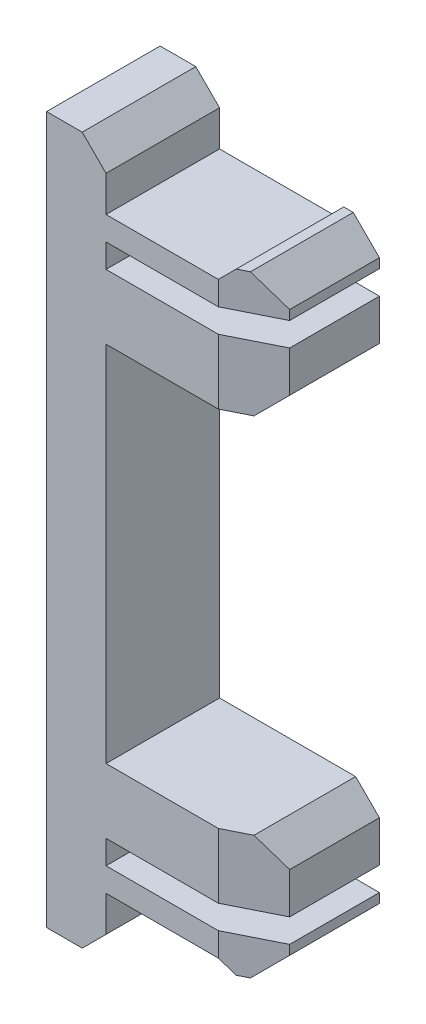
ISO-10303-21;
HEADER;
FILE_DESCRIPTION(('STEP AP214'),'2;1');
FILE_NAME('part.step','',(''),(''),'','','');
FILE_SCHEMA(('AUTOMOTIVE_DESIGN { 1 0 10303 214 1 1 1 1 }'));
ENDSEC;
DATA;
#1=APPLICATION_CONTEXT('core data for automotive mechanical design processes');
#2=APPLICATION_PROTOCOL_DEFINITION('international standard','automotive_design',2000,#1);
#3=PRODUCT_CONTEXT('',#1,'mechanical');
#4=PRODUCT('Part','Part','',(#3));
#5=PRODUCT_RELATED_PRODUCT_CATEGORY('part','',(#4));
#6=PRODUCT_DEFINITION_FORMATION('','',#4);
#7=PRODUCT_DEFINITION_CONTEXT('part definition',#1,'design');
#8=PRODUCT_DEFINITION('design','',#6,#7);
#9=PRODUCT_DEFINITION_SHAPE('','',#8);
#10=(LENGTH_UNIT() NAMED_UNIT(*) SI_UNIT(.MILLI.,.METRE.));
#11=(NAMED_UNIT(*) PLANE_ANGLE_UNIT() SI_UNIT($,.RADIAN.));
#12=(NAMED_UNIT(*) SI_UNIT($,.STERADIAN.) SOLID_ANGLE_UNIT());
#13=UNCERTAINTY_MEASURE_WITH_UNIT(LENGTH_MEASURE(1.E-05),#10,'distance_accuracy_value','');
#14=(GEOMETRIC_REPRESENTATION_CONTEXT(3) GLOBAL_UNCERTAINTY_ASSIGNED_CONTEXT((#13)) GLOBAL_UNIT_ASSIGNED_CONTEXT((#10,
#11,#12)) REPRESENTATION_CONTEXT('',''));
#15=CARTESIAN_POINT('',(0.,0.,0.));
#16=DIRECTION('',(0.,0.,1.));
#17=DIRECTION('',(1.,0.,0.));
#18=AXIS2_PLACEMENT_3D('',#15,#16,#17);
#19=CARTESIAN_POINT('',(-2.6825,-17.605,3.032500031));
#20=DIRECTION('',(-1.,0.,0.));
#21=DIRECTION('',(0.,0.,1.));
#22=AXIS2_PLACEMENT_3D('',#19,#20,#21);
#23=PLANE('',#22);
#24=DIRECTION('',(0.,0.,-1.));
#25=VECTOR('',#24,1.);
#26=CARTESIAN_POINT('',(-2.6825,-9.7,12.2467932757367));
#27=LINE('',#26,#25);
#28=CARTESIAN_POINT('',(-2.6825,-9.7,3.032500031));
#29=VERTEX_POINT('',#28);
#30=CARTESIAN_POINT('',(-2.6825,-9.7,-3.032500031));
#31=VERTEX_POINT('',#30);
#32=EDGE_CURVE('E290',#29,#31,#27,.T.);
#33=ORIENTED_EDGE('',*,*,#32,.T.);
#34=DIRECTION('',(0.,1.,0.));
#35=VECTOR('',#34,1.);
#36=CARTESIAN_POINT('',(-2.6825,-17.605,-3.032500031));
#37=LINE('',#36,#35);
#38=CARTESIAN_POINT('',(-2.6825,9.7,-3.032500031));
#39=VERTEX_POINT('',#38);
#40=EDGE_CURVE('E484',#31,#39,#37,.T.);
#41=ORIENTED_EDGE('',*,*,#40,.T.);
#42=DIRECTION('',(0.,0.,-1.));
#43=VECTOR('',#42,1.);
#44=CARTESIAN_POINT('',(-2.6825,9.7,12.2467932757367));
#45=LINE('',#44,#43);
#46=CARTESIAN_POINT('',(-2.6825,9.7,3.032500031));
#47=VERTEX_POINT('',#46);
#48=EDGE_CURVE('E416',#47,#39,#45,.T.);
#49=ORIENTED_EDGE('',*,*,#48,.F.);
#50=DIRECTION('',(0.,1.,0.));
#51=VECTOR('',#50,1.);
#52=CARTESIAN_POINT('',(-2.6825,-17.605,3.032500031));
#53=LINE('',#52,#51);
#54=EDGE_CURVE('E67',#29,#47,#53,.T.);
#55=ORIENTED_EDGE('',*,*,#54,.F.);
#56=EDGE_LOOP('',(#33,#41,#49,#55));
#57=FACE_BOUND('',#56,.T.);
#58=ADVANCED_FACE('F51',(#57),#23,.F.);
#59=DIRECTION('',(0.,0.,-1.));
#60=VECTOR('',#59,1.);
#61=CARTESIAN_POINT('',(-2.6825,-13.16,12.2467932757367));
#62=LINE('',#61,#60);
#63=CARTESIAN_POINT('',(-2.6825,-13.16,3.032500031));
#64=VERTEX_POINT('',#63);
#65=CARTESIAN_POINT('',(-2.6825,-13.16,-3.032500031));
#66=VERTEX_POINT('',#65);
#67=EDGE_CURVE('E75',#64,#66,#62,.T.);
#68=ORIENTED_EDGE('',*,*,#67,.F.);
#69=CARTESIAN_POINT('',(-2.6825,-14.43,3.032500031));
#70=VERTEX_POINT('',#69);
#71=EDGE_CURVE('E457',#70,#64,#53,.T.);
#72=ORIENTED_EDGE('',*,*,#71,.F.);
#73=DIRECTION('',(0.,0.,-1.));
#74=VECTOR('',#73,1.);
#75=CARTESIAN_POINT('',(-2.6825,-14.43,12.2467932757367));
#76=LINE('',#75,#74);
#77=CARTESIAN_POINT('',(-2.6825,-14.43,-3.032500031));
#78=VERTEX_POINT('',#77);
#79=EDGE_CURVE('E1014',#70,#78,#76,.T.);
#80=ORIENTED_EDGE('',*,*,#79,.T.);
#81=EDGE_CURVE('E483',#78,#66,#37,.T.);
#82=ORIENTED_EDGE('',*,*,#81,.T.);
#83=EDGE_LOOP('',(#68,#72,#80,#82));
#84=FACE_BOUND('',#83,.T.);
#85=ADVANCED_FACE('F637',(#84),#23,.F.);
#86=DIRECTION('',(0.,0.,-1.));
#87=VECTOR('',#86,1.);
#88=CARTESIAN_POINT('',(-2.6825,14.43,12.2467932757367));
#89=LINE('',#88,#87);
#90=CARTESIAN_POINT('',(-2.6825,14.43,3.032500031));
#91=VERTEX_POINT('',#90);
#92=CARTESIAN_POINT('',(-2.6825,14.43,-3.032500031));
#93=VERTEX_POINT('',#92);
#94=EDGE_CURVE('E356',#91,#93,#89,.T.);
#95=ORIENTED_EDGE('',*,*,#94,.F.);
#96=CARTESIAN_POINT('',(-2.6825,13.16,3.032500031));
#97=VERTEX_POINT('',#96);
#98=EDGE_CURVE('E458',#97,#91,#53,.T.);
#99=ORIENTED_EDGE('',*,*,#98,.F.);
#100=DIRECTION('',(0.,0.,-1.));
#101=VECTOR('',#100,1.);
#102=CARTESIAN_POINT('',(-2.6825,13.16,12.2467932757367));
#103=LINE('',#102,#101);
#104=CARTESIAN_POINT('',(-2.6825,13.16,-3.032500031));
#105=VERTEX_POINT('',#104);
#106=EDGE_CURVE('E435',#97,#105,#103,.T.);
#107=ORIENTED_EDGE('',*,*,#106,.T.);
#108=EDGE_CURVE('E485',#105,#93,#37,.T.);
#109=ORIENTED_EDGE('',*,*,#108,.T.);
#110=EDGE_LOOP('',(#95,#99,#107,#109));
#111=FACE_BOUND('',#110,.T.);
#112=ADVANCED_FACE('F615',(#111),#23,.F.);
#113=CARTESIAN_POINT('',(-2.6825,-17.605,-3.032500031));
#114=VERTEX_POINT('',#113);
#115=CARTESIAN_POINT('',(-2.6825,-15.7,-3.032500031));
#116=VERTEX_POINT('',#115);
#117=EDGE_CURVE('E478',#114,#116,#37,.T.);
#118=ORIENTED_EDGE('',*,*,#117,.T.);
#119=DIRECTION('',(0.,0.,-1.));
#120=VECTOR('',#119,1.);
#121=CARTESIAN_POINT('',(-2.6825,-15.7,12.2467932757367));
#122=LINE('',#121,#120);
#123=CARTESIAN_POINT('',(-2.6825,-15.7,3.032500031));
#124=VERTEX_POINT('',#123);
#125=EDGE_CURVE('E1038',#124,#116,#122,.T.);
#126=ORIENTED_EDGE('',*,*,#125,.F.);
#127=CARTESIAN_POINT('',(-2.6825,-17.605,3.032500031));
#128=VERTEX_POINT('',#127);
#129=EDGE_CURVE('E452',#128,#124,#53,.T.);
#130=ORIENTED_EDGE('',*,*,#129,.F.);
#131=DIRECTION('',(0.,0.,-1.));
#132=VECTOR('',#131,1.);
#133=CARTESIAN_POINT('',(-2.6825,-17.605,3.032500031));
#134=LINE('',#133,#132);
#135=EDGE_CURVE('E60',#128,#114,#134,.T.);
#136=ORIENTED_EDGE('',*,*,#135,.T.);
#137=EDGE_LOOP('',(#118,#126,#130,#136));
#138=FACE_BOUND('',#137,.T.);
#139=ADVANCED_FACE('F519',(#138),#23,.F.);
#140=CARTESIAN_POINT('',(-3.9525,-18.875,3.032500031));
#141=DIRECTION('',(-0.707106781186544,0.707106781186551,0.));
#142=DIRECTION('',(-0.707106781186551,-0.707106781186544,0.));
#143=AXIS2_PLACEMENT_3D('',#140,#141,#142);
#144=PLANE('',#143);
#145=DIRECTION('',(0.707106781186551,0.707106781186544,0.));
#146=VECTOR('',#145,1.);
#147=CARTESIAN_POINT('',(-3.9525,-18.875,-3.032500031));
#148=LINE('',#147,#146);
#149=CARTESIAN_POINT('',(-3.9525,-18.875,-3.032500031));
#150=VERTEX_POINT('',#149);
#151=EDGE_CURVE('E387',#150,#114,#148,.T.);
#152=ORIENTED_EDGE('',*,*,#151,.T.);
#153=ORIENTED_EDGE('',*,*,#135,.F.);
#154=DIRECTION('',(0.707106781186551,0.707106781186544,0.));
#155=VECTOR('',#154,1.);
#156=CARTESIAN_POINT('',(-3.9525,-18.875,3.032500031));
#157=LINE('',#156,#155);
#158=CARTESIAN_POINT('',(-3.9525,-18.875,3.032500031));
#159=VERTEX_POINT('',#158);
#160=EDGE_CURVE('E446',#159,#128,#157,.T.);
#161=ORIENTED_EDGE('',*,*,#160,.F.);
#162=DIRECTION('',(0.,0.,-1.));
#163=VECTOR('',#162,1.);
#164=CARTESIAN_POINT('',(-3.9525,-18.875,3.032500031));
#165=LINE('',#164,#163);
#166=EDGE_CURVE('E473',#159,#150,#165,.T.);
#167=ORIENTED_EDGE('',*,*,#166,.T.);
#168=EDGE_LOOP('',(#152,#153,#161,#167));
#169=FACE_BOUND('',#168,.T.);
#170=ADVANCED_FACE('F53',(#169),#144,.F.);
#171=CARTESIAN_POINT('',(-2.6825,15.7,3.032500031));
#172=VERTEX_POINT('',#171);
#173=CARTESIAN_POINT('',(-2.6825,17.605,3.032500031));
#174=VERTEX_POINT('',#173);
#175=EDGE_CURVE('E450',#172,#174,#53,.T.);
#176=ORIENTED_EDGE('',*,*,#175,.F.);
#177=DIRECTION('',(0.,0.,-1.));
#178=VECTOR('',#177,1.);
#179=CARTESIAN_POINT('',(-2.6825,15.7,12.2467932757367));
#180=LINE('',#179,#178);
#181=CARTESIAN_POINT('',(-2.6825,15.7,-3.032500031));
#182=VERTEX_POINT('',#181);
#183=EDGE_CURVE('E391',#172,#182,#180,.T.);
#184=ORIENTED_EDGE('',*,*,#183,.T.);
#185=CARTESIAN_POINT('',(-2.6825,17.605,-3.032500031));
#186=VERTEX_POINT('',#185);
#187=EDGE_CURVE('E477',#182,#186,#37,.T.);
#188=ORIENTED_EDGE('',*,*,#187,.T.);
#189=DIRECTION('',(0.,0.,-1.));
#190=VECTOR('',#189,1.);
#191=CARTESIAN_POINT('',(-2.6825,17.605,3.032500031));
#192=LINE('',#191,#190);
#193=EDGE_CURVE('E511',#174,#186,#192,.T.);
#194=ORIENTED_EDGE('',*,*,#193,.F.);
#195=EDGE_LOOP('',(#176,#184,#188,#194));
#196=FACE_BOUND('',#195,.T.);
#197=ADVANCED_FACE('F546',(#196),#23,.F.);
#198=CARTESIAN_POINT('',(-3.9525,18.875,3.032500031));
#199=DIRECTION('',(0.707106781186544,0.707106781186551,0.));
#200=DIRECTION('',(-0.707106781186551,0.707106781186544,0.));
#201=AXIS2_PLACEMENT_3D('',#198,#199,#200);
#202=PLANE('',#201);
#203=DIRECTION('',(0.707106781186551,-0.707106781186544,0.));
#204=VECTOR('',#203,1.);
#205=CARTESIAN_POINT('',(-3.9525,18.875,-3.032500031));
#206=LINE('',#205,#204);
#207=CARTESIAN_POINT('',(-3.9525,18.875,-3.032500031));
#208=VERTEX_POINT('',#207);
#209=EDGE_CURVE('E482',#208,#186,#206,.T.);
#210=ORIENTED_EDGE('',*,*,#209,.F.);
#211=DIRECTION('',(0.,0.,-1.));
#212=VECTOR('',#211,1.);
#213=CARTESIAN_POINT('',(-3.9525,18.875,3.032500031));
#214=LINE('',#213,#212);
#215=CARTESIAN_POINT('',(-3.9525,18.875,3.032500031));
#216=VERTEX_POINT('',#215);
#217=EDGE_CURVE('E508',#216,#208,#214,.T.);
#218=ORIENTED_EDGE('',*,*,#217,.F.);
#219=DIRECTION('',(0.707106781186551,-0.707106781186544,0.));
#220=VECTOR('',#219,1.);
#221=CARTESIAN_POINT('',(-3.9525,18.875,3.032500031));
#222=LINE('',#221,#220);
#223=EDGE_CURVE('E456',#216,#174,#222,.T.);
#224=ORIENTED_EDGE('',*,*,#223,.T.);
#225=ORIENTED_EDGE('',*,*,#193,.T.);
#226=EDGE_LOOP('',(#210,#218,#224,#225));
#227=FACE_BOUND('',#226,.T.);
#228=ADVANCED_FACE('F541',(#227),#202,.T.);
#229=CARTESIAN_POINT('',(-3.9525,18.875,3.032500031));
#230=DIRECTION('',(0.,-1.,0.));
#231=DIRECTION('',(0.,0.,-1.));
#232=AXIS2_PLACEMENT_3D('',#229,#230,#231);
#233=PLANE('',#232);
#234=DIRECTION('',(-1.,0.,0.));
#235=VECTOR('',#234,1.);
#236=CARTESIAN_POINT('',(-3.9525,18.875,-3.032500031));
#237=LINE('',#236,#235);
#238=CARTESIAN_POINT('',(-5.8575,18.875,-3.032500031));
#239=VERTEX_POINT('',#238);
#240=EDGE_CURVE('E489',#208,#239,#237,.T.);
#241=ORIENTED_EDGE('',*,*,#240,.T.);
#242=DIRECTION('',(0.,0.,-1.));
#243=VECTOR('',#242,1.);
#244=CARTESIAN_POINT('',(-5.8575,18.875,3.032500031));
#245=LINE('',#244,#243);
#246=CARTESIAN_POINT('',(-5.8575,18.875,3.032500031));
#247=VERTEX_POINT('',#246);
#248=EDGE_CURVE('E505',#247,#239,#245,.T.);
#249=ORIENTED_EDGE('',*,*,#248,.F.);
#250=DIRECTION('',(-1.,0.,0.));
#251=VECTOR('',#250,1.);
#252=CARTESIAN_POINT('',(-3.9525,18.875,3.032500031));
#253=LINE('',#252,#251);
#254=EDGE_CURVE('E462',#216,#247,#253,.T.);
#255=ORIENTED_EDGE('',*,*,#254,.F.);
#256=ORIENTED_EDGE('',*,*,#217,.T.);
#257=EDGE_LOOP('',(#241,#249,#255,#256));
#258=FACE_BOUND('',#257,.T.);
#259=ADVANCED_FACE('F645',(#258),#233,.F.);
#260=CARTESIAN_POINT('',(-5.8575,-18.875,3.032500031));
#261=DIRECTION('',(-1.,0.,0.));
#262=DIRECTION('',(0.,0.,1.));
#263=AXIS2_PLACEMENT_3D('',#260,#261,#262);
#264=PLANE('',#263);
#265=DIRECTION('',(0.,1.,0.));
#266=VECTOR('',#265,1.);
#267=CARTESIAN_POINT('',(-5.8575,-18.875,-3.032500031));
#268=LINE('',#267,#266);
#269=CARTESIAN_POINT('',(-5.8575,-18.875,-3.032500031));
#270=VERTEX_POINT('',#269);
#271=EDGE_CURVE('E493',#270,#239,#268,.T.);
#272=ORIENTED_EDGE('',*,*,#271,.F.);
#273=DIRECTION('',(0.,0.,-1.));
#274=VECTOR('',#273,1.);
#275=CARTESIAN_POINT('',(-5.8575,-18.875,3.032500031));
#276=LINE('',#275,#274);
#277=CARTESIAN_POINT('',(-5.8575,-18.875,3.032500031));
#278=VERTEX_POINT('',#277);
#279=EDGE_CURVE('E502',#278,#270,#276,.T.);
#280=ORIENTED_EDGE('',*,*,#279,.F.);
#281=DIRECTION('',(0.,1.,0.));
#282=VECTOR('',#281,1.);
#283=CARTESIAN_POINT('',(-5.8575,-18.875,3.032500031));
#284=LINE('',#283,#282);
#285=EDGE_CURVE('E465',#278,#247,#284,.T.);
#286=ORIENTED_EDGE('',*,*,#285,.T.);
#287=ORIENTED_EDGE('',*,*,#248,.T.);
#288=EDGE_LOOP('',(#272,#280,#286,#287));
#289=FACE_BOUND('',#288,.T.);
#290=ADVANCED_FACE('F534',(#289),#264,.T.);
#291=CARTESIAN_POINT('',(-3.9525,-18.875,3.032500031));
#292=DIRECTION('',(0.,-1.,0.));
#293=DIRECTION('',(0.,0.,-1.));
#294=AXIS2_PLACEMENT_3D('',#291,#292,#293);
#295=PLANE('',#294);
#296=DIRECTION('',(-1.,0.,0.));
#297=VECTOR('',#296,1.);
#298=CARTESIAN_POINT('',(-3.9525,-18.875,-3.032500031));
#299=LINE('',#298,#297);
#300=EDGE_CURVE('E451',#150,#270,#299,.T.);
#301=ORIENTED_EDGE('',*,*,#300,.F.);
#302=ORIENTED_EDGE('',*,*,#166,.F.);
#303=DIRECTION('',(-1.,0.,0.));
#304=VECTOR('',#303,1.);
#305=CARTESIAN_POINT('',(-3.9525,-18.875,3.032500031));
#306=LINE('',#305,#304);
#307=EDGE_CURVE('E469',#159,#278,#306,.T.);
#308=ORIENTED_EDGE('',*,*,#307,.T.);
#309=ORIENTED_EDGE('',*,*,#279,.T.);
#310=EDGE_LOOP('',(#301,#302,#308,#309));
#311=FACE_BOUND('',#310,.T.);
#312=ADVANCED_FACE('F529',(#311),#295,.T.);
#313=CARTESIAN_POINT('',(0.,0.,3.032500031));
#314=DIRECTION('',(0.,0.,-1.));
#315=DIRECTION('',(-1.,0.,0.));
#316=AXIS2_PLACEMENT_3D('',#313,#314,#315);
#317=PLANE('',#316);
#318=ORIENTED_EDGE('',*,*,#54,.T.);
#319=DIRECTION('',(-1.,0.,0.));
#320=VECTOR('',#319,1.);
#321=CARTESIAN_POINT('',(0.,9.7,3.032500031));
#322=LINE('',#321,#320);
#323=CARTESIAN_POINT('',(3.3175,9.7,3.032500031));
#324=VERTEX_POINT('',#323);
#325=EDGE_CURVE('E377',#324,#47,#322,.T.);
#326=ORIENTED_EDGE('',*,*,#325,.F.);
#327=DIRECTION('',(0.,-1.,0.));
#328=VECTOR('',#327,1.);
#329=CARTESIAN_POINT('',(3.3175,18.875,3.032500031));
#330=LINE('',#329,#328);
#331=CARTESIAN_POINT('',(3.3175,13.16,3.032500031));
#332=VERTEX_POINT('',#331);
#333=EDGE_CURVE('E325',#332,#324,#330,.T.);
#334=ORIENTED_EDGE('',*,*,#333,.F.);
#335=DIRECTION('',(1.,0.,0.));
#336=VECTOR('',#335,1.);
#337=CARTESIAN_POINT('',(0.,13.16,3.032500031));
#338=LINE('',#337,#336);
#339=EDGE_CURVE('E424',#97,#332,#338,.T.);
#340=ORIENTED_EDGE('',*,*,#339,.F.);
#341=ORIENTED_EDGE('',*,*,#98,.T.);
#342=DIRECTION('',(1.,0.,0.));
#343=VECTOR('',#342,1.);
#344=CARTESIAN_POINT('',(0.,14.43,3.032500031));
#345=LINE('',#344,#343);
#346=CARTESIAN_POINT('',(3.3175,14.43,3.032500031));
#347=VERTEX_POINT('',#346);
#348=EDGE_CURVE('E382',#91,#347,#345,.T.);
#349=ORIENTED_EDGE('',*,*,#348,.T.);
#350=CARTESIAN_POINT('',(3.3175,15.7,3.032500031));
#351=VERTEX_POINT('',#350);
#352=EDGE_CURVE('E331',#351,#347,#330,.T.);
#353=ORIENTED_EDGE('',*,*,#352,.F.);
#354=DIRECTION('',(-1.,0.,0.));
#355=VECTOR('',#354,1.);
#356=CARTESIAN_POINT('',(0.,15.7,3.032500031));
#357=LINE('',#356,#355);
#358=EDGE_CURVE('E378',#351,#172,#357,.T.);
#359=ORIENTED_EDGE('',*,*,#358,.T.);
#360=ORIENTED_EDGE('',*,*,#175,.T.);
#361=ORIENTED_EDGE('',*,*,#223,.F.);
#362=ORIENTED_EDGE('',*,*,#254,.T.);
#363=ORIENTED_EDGE('',*,*,#285,.F.);
#364=ORIENTED_EDGE('',*,*,#307,.F.);
#365=ORIENTED_EDGE('',*,*,#160,.T.);
#366=ORIENTED_EDGE('',*,*,#129,.T.);
#367=DIRECTION('',(-1.,0.,0.));
#368=VECTOR('',#367,1.);
#369=CARTESIAN_POINT('',(0.,-15.7,3.032500031));
#370=LINE('',#369,#368);
#371=CARTESIAN_POINT('',(3.3175,-15.7,3.032500031));
#372=VERTEX_POINT('',#371);
#373=EDGE_CURVE('E1029',#372,#124,#370,.T.);
#374=ORIENTED_EDGE('',*,*,#373,.F.);
#375=DIRECTION('',(0.,1.,0.));
#376=VECTOR('',#375,1.);
#377=CARTESIAN_POINT('',(3.3175,-18.875,3.032500031));
#378=LINE('',#377,#376);
#379=CARTESIAN_POINT('',(3.3175,-14.43,3.032500031));
#380=VERTEX_POINT('',#379);
#381=EDGE_CURVE('E286',#372,#380,#378,.T.);
#382=ORIENTED_EDGE('',*,*,#381,.T.);
#383=DIRECTION('',(1.,0.,0.));
#384=VECTOR('',#383,1.);
#385=CARTESIAN_POINT('',(0.,-14.43,3.032500031));
#386=LINE('',#385,#384);
#387=EDGE_CURVE('E322',#70,#380,#386,.T.);
#388=ORIENTED_EDGE('',*,*,#387,.F.);
#389=ORIENTED_EDGE('',*,*,#71,.T.);
#390=DIRECTION('',(1.,0.,0.));
#391=VECTOR('',#390,1.);
#392=CARTESIAN_POINT('',(0.,-13.16,3.032500031));
#393=LINE('',#392,#391);
#394=CARTESIAN_POINT('',(3.3175,-13.16,3.032500031));
#395=VERTEX_POINT('',#394);
#396=EDGE_CURVE('E284',#64,#395,#393,.T.);
#397=ORIENTED_EDGE('',*,*,#396,.T.);
#398=CARTESIAN_POINT('',(3.3175,-9.7,3.032500031));
#399=VERTEX_POINT('',#398);
#400=EDGE_CURVE('E270',#395,#399,#378,.T.);
#401=ORIENTED_EDGE('',*,*,#400,.T.);
#402=DIRECTION('',(-1.,0.,0.));
#403=VECTOR('',#402,1.);
#404=CARTESIAN_POINT('',(0.,-9.7,3.032500031));
#405=LINE('',#404,#403);
#406=EDGE_CURVE('E281',#399,#29,#405,.T.);
#407=ORIENTED_EDGE('',*,*,#406,.T.);
#408=EDGE_LOOP('',(#318,#326,#334,#340,#341,#349,#353,#359,#360,#361,#362,#363,#364,#365,#366,
#374,#382,#388,#389,#397,#401,#407));
#409=FACE_BOUND('',#408,.T.);
#410=ADVANCED_FACE('F280',(#409),#317,.F.);
#411=CARTESIAN_POINT('',(0.,0.,-3.032500031));
#412=DIRECTION('',(0.,0.,-1.));
#413=DIRECTION('',(-1.,0.,0.));
#414=AXIS2_PLACEMENT_3D('',#411,#412,#413);
#415=PLANE('',#414);
#416=ORIENTED_EDGE('',*,*,#108,.F.);
#417=DIRECTION('',(-1.,0.,0.));
#418=VECTOR('',#417,1.);
#419=CARTESIAN_POINT('',(0.,13.16,-3.032500031));
#420=LINE('',#419,#418);
#421=CARTESIAN_POINT('',(5.8575,13.16,-3.032500031));
#422=VERTEX_POINT('',#421);
#423=EDGE_CURVE('E417',#422,#105,#420,.T.);
#424=ORIENTED_EDGE('',*,*,#423,.F.);
#425=DIRECTION('',(0.,1.,0.));
#426=VECTOR('',#425,1.);
#427=CARTESIAN_POINT('',(5.8575,0.,-3.032500031));
#428=LINE('',#427,#426);
#429=CARTESIAN_POINT('',(5.8575,10.97,-3.032500031));
#430=VERTEX_POINT('',#429);
#431=EDGE_CURVE('E411',#430,#422,#428,.T.);
#432=ORIENTED_EDGE('',*,*,#431,.F.);
#433=DIRECTION('',(0.707106781186548,0.707106781186548,0.));
#434=VECTOR('',#433,1.);
#435=CARTESIAN_POINT('',(-2.55625,2.55625,-3.032500031));
#436=LINE('',#435,#434);
#437=CARTESIAN_POINT('',(4.5875,9.7,-3.032500031));
#438=VERTEX_POINT('',#437);
#439=EDGE_CURVE('E351',#438,#430,#436,.T.);
#440=ORIENTED_EDGE('',*,*,#439,.F.);
#441=DIRECTION('',(1.,0.,0.));
#442=VECTOR('',#441,1.);
#443=CARTESIAN_POINT('',(0.,9.7,-3.032500031));
#444=LINE('',#443,#442);
#445=EDGE_CURVE('E412',#39,#438,#444,.T.);
#446=ORIENTED_EDGE('',*,*,#445,.F.);
#447=ORIENTED_EDGE('',*,*,#40,.F.);
#448=DIRECTION('',(1.,0.,0.));
#449=VECTOR('',#448,1.);
#450=CARTESIAN_POINT('',(0.,-9.7,-3.032500031));
#451=LINE('',#450,#449);
#452=CARTESIAN_POINT('',(4.5875,-9.7,-3.032500031));
#453=VERTEX_POINT('',#452);
#454=EDGE_CURVE('E306',#31,#453,#451,.T.);
#455=ORIENTED_EDGE('',*,*,#454,.T.);
#456=DIRECTION('',(0.707106781186548,-0.707106781186548,0.));
#457=VECTOR('',#456,1.);
#458=CARTESIAN_POINT('',(-2.55625,-2.55625,-3.032500031));
#459=LINE('',#458,#457);
#460=CARTESIAN_POINT('',(5.8575,-10.97,-3.032500031));
#461=VERTEX_POINT('',#460);
#462=EDGE_CURVE('E1003',#453,#461,#459,.T.);
#463=ORIENTED_EDGE('',*,*,#462,.T.);
#464=DIRECTION('',(0.,-1.,0.));
#465=VECTOR('',#464,1.);
#466=CARTESIAN_POINT('',(5.8575,0.,-3.032500031));
#467=LINE('',#466,#465);
#468=CARTESIAN_POINT('',(5.8575,-13.16,-3.032500031));
#469=VERTEX_POINT('',#468);
#470=EDGE_CURVE('E1059',#461,#469,#467,.T.);
#471=ORIENTED_EDGE('',*,*,#470,.T.);
#472=DIRECTION('',(-1.,0.,0.));
#473=VECTOR('',#472,1.);
#474=CARTESIAN_POINT('',(0.,-13.16,-3.032500031));
#475=LINE('',#474,#473);
#476=EDGE_CURVE('E1062',#469,#66,#475,.T.);
#477=ORIENTED_EDGE('',*,*,#476,.T.);
#478=ORIENTED_EDGE('',*,*,#81,.F.);
#479=DIRECTION('',(-1.,0.,0.));
#480=VECTOR('',#479,1.);
#481=CARTESIAN_POINT('',(0.,-14.43,-3.032500031));
#482=LINE('',#481,#480);
#483=CARTESIAN_POINT('',(5.8575,-14.43,-3.032500031));
#484=VERTEX_POINT('',#483);
#485=EDGE_CURVE('E298',#484,#78,#482,.T.);
#486=ORIENTED_EDGE('',*,*,#485,.F.);
#487=DIRECTION('',(0.,1.,0.));
#488=VECTOR('',#487,1.);
#489=CARTESIAN_POINT('',(5.8575,0.,-3.032500031));
#490=LINE('',#489,#488);
#491=CARTESIAN_POINT('',(5.8575,-14.938,-3.032500031));
#492=VERTEX_POINT('',#491);
#493=EDGE_CURVE('E292',#492,#484,#490,.T.);
#494=ORIENTED_EDGE('',*,*,#493,.F.);
#495=DIRECTION('',(0.707106781186548,0.707106781186547,0.));
#496=VECTOR('',#495,1.);
#497=CARTESIAN_POINT('',(10.39775,-10.39775,-3.032500031));
#498=LINE('',#497,#496);
#499=CARTESIAN_POINT('',(4.4605,-16.335,-3.032500031));
#500=VERTEX_POINT('',#499);
#501=EDGE_CURVE('E1010',#500,#492,#498,.T.);
#502=ORIENTED_EDGE('',*,*,#501,.F.);
#503=DIRECTION('',(1.,0.,0.));
#504=VECTOR('',#503,1.);
#505=CARTESIAN_POINT('',(-1.11561842441264E-13,-16.335,-3.032500031));
#506=LINE('',#505,#504);
#507=CARTESIAN_POINT('',(3.9525,-16.335,-3.032500031));
#508=VERTEX_POINT('',#507);
#509=EDGE_CURVE('E1015',#508,#500,#506,.T.);
#510=ORIENTED_EDGE('',*,*,#509,.F.);
#511=DIRECTION('',(0.707106781186546,-0.707106781186549,0.));
#512=VECTOR('',#511,1.);
#513=CARTESIAN_POINT('',(-6.19124999999999,-6.19124999999997,-3.032500031));
#514=LINE('',#513,#512);
#515=CARTESIAN_POINT('',(3.3175,-15.7,-3.032500031));
#516=VERTEX_POINT('',#515);
#517=EDGE_CURVE('E1019',#516,#508,#514,.T.);
#518=ORIENTED_EDGE('',*,*,#517,.F.);
#519=DIRECTION('',(1.,0.,0.));
#520=VECTOR('',#519,1.);
#521=CARTESIAN_POINT('',(0.,-15.7,-3.032500031));
#522=LINE('',#521,#520);
#523=EDGE_CURVE('E1023',#116,#516,#522,.T.);
#524=ORIENTED_EDGE('',*,*,#523,.F.);
#525=ORIENTED_EDGE('',*,*,#117,.F.);
#526=ORIENTED_EDGE('',*,*,#151,.F.);
#527=ORIENTED_EDGE('',*,*,#300,.T.);
#528=ORIENTED_EDGE('',*,*,#271,.T.);
#529=ORIENTED_EDGE('',*,*,#240,.F.);
#530=ORIENTED_EDGE('',*,*,#209,.T.);
#531=ORIENTED_EDGE('',*,*,#187,.F.);
#532=DIRECTION('',(1.,0.,0.));
#533=VECTOR('',#532,1.);
#534=CARTESIAN_POINT('',(0.,15.7,-3.032500031));
#535=LINE('',#534,#533);
#536=CARTESIAN_POINT('',(3.3175,15.7,-3.032500031));
#537=VERTEX_POINT('',#536);
#538=EDGE_CURVE('E365',#182,#537,#535,.T.);
#539=ORIENTED_EDGE('',*,*,#538,.T.);
#540=DIRECTION('',(0.707106781186546,0.707106781186549,0.));
#541=VECTOR('',#540,1.);
#542=CARTESIAN_POINT('',(-6.19124999999999,6.19124999999997,-3.032500031));
#543=LINE('',#542,#541);
#544=CARTESIAN_POINT('',(3.9525,16.335,-3.032500031));
#545=VERTEX_POINT('',#544);
#546=EDGE_CURVE('E361',#537,#545,#543,.T.);
#547=ORIENTED_EDGE('',*,*,#546,.T.);
#548=DIRECTION('',(1.,0.,0.));
#549=VECTOR('',#548,1.);
#550=CARTESIAN_POINT('',(-1.11561842441264E-13,16.335,-3.032500031));
#551=LINE('',#550,#549);
#552=CARTESIAN_POINT('',(4.4605,16.335,-3.032500031));
#553=VERTEX_POINT('',#552);
#554=EDGE_CURVE('E357',#545,#553,#551,.T.);
#555=ORIENTED_EDGE('',*,*,#554,.T.);
#556=DIRECTION('',(0.707106781186548,-0.707106781186547,0.));
#557=VECTOR('',#556,1.);
#558=CARTESIAN_POINT('',(10.39775,10.39775,-3.032500031));
#559=LINE('',#558,#557);
#560=CARTESIAN_POINT('',(5.8575,14.938,-3.032500031));
#561=VERTEX_POINT('',#560);
#562=EDGE_CURVE('E352',#553,#561,#559,.T.);
#563=ORIENTED_EDGE('',*,*,#562,.T.);
#564=DIRECTION('',(0.,-1.,0.));
#565=VECTOR('',#564,1.);
#566=CARTESIAN_POINT('',(5.8575,0.,-3.032500031));
#567=LINE('',#566,#565);
#568=CARTESIAN_POINT('',(5.8575,14.43,-3.032500031));
#569=VERTEX_POINT('',#568);
#570=EDGE_CURVE('E373',#561,#569,#567,.T.);
#571=ORIENTED_EDGE('',*,*,#570,.T.);
#572=DIRECTION('',(-1.,0.,0.));
#573=VECTOR('',#572,1.);
#574=CARTESIAN_POINT('',(0.,14.43,-3.032500031));
#575=LINE('',#574,#573);
#576=EDGE_CURVE('E369',#569,#93,#575,.T.);
#577=ORIENTED_EDGE('',*,*,#576,.T.);
#578=EDGE_LOOP('',(#416,#424,#432,#440,#446,#447,#455,#463,#471,#477,#478,#486,#494,#502,#510,
#518,#524,#525,#526,#527,#528,#529,#530,#531,#539,#547,#555,#563,#571,#577));
#579=FACE_BOUND('',#578,.T.);
#580=ADVANCED_FACE('F527',(#579),#415,.T.);
#581=CARTESIAN_POINT('',(0.,9.7,12.2467932757367));
#582=DIRECTION('',(0.,1.,0.));
#583=DIRECTION('',(-1.,0.,0.));
#584=AXIS2_PLACEMENT_3D('',#581,#582,#583);
#585=PLANE('',#584);
#586=DIRECTION('',(0.,0.,-1.));
#587=VECTOR('',#586,1.);
#588=CARTESIAN_POINT('',(4.5875,9.7,12.2467932757367));
#589=LINE('',#588,#587);
#590=CARTESIAN_POINT('',(4.5875,9.7,2.397500031));
#591=VERTEX_POINT('',#590);
#592=EDGE_CURVE('E428',#591,#438,#589,.T.);
#593=ORIENTED_EDGE('',*,*,#592,.F.);
#594=DIRECTION('',(0.894427190999916,0.,-0.447213595499958));
#595=VECTOR('',#594,1.);
#596=CARTESIAN_POINT('',(3.3175,9.7,3.032500031));
#597=LINE('',#596,#595);
#598=EDGE_CURVE('E321',#324,#591,#597,.T.);
#599=ORIENTED_EDGE('',*,*,#598,.F.);
#600=ORIENTED_EDGE('',*,*,#325,.T.);
#601=ORIENTED_EDGE('',*,*,#48,.T.);
#602=ORIENTED_EDGE('',*,*,#445,.T.);
#603=EDGE_LOOP('',(#593,#599,#600,#601,#602));
#604=FACE_BOUND('',#603,.T.);
#605=ADVANCED_FACE('F564',(#604),#585,.F.);
#606=CARTESIAN_POINT('',(-2.55625,2.55625,12.2467932757367));
#607=DIRECTION('',(-0.707106781186548,0.707106781186548,0.));
#608=DIRECTION('',(-0.707106781186548,-0.707106781186548,0.));
#609=AXIS2_PLACEMENT_3D('',#606,#607,#608);
#610=PLANE('',#609);
#611=DIRECTION('',(0.,0.,-1.));
#612=VECTOR('',#611,1.);
#613=CARTESIAN_POINT('',(5.8575,10.97,12.2467932757367));
#614=LINE('',#613,#612);
#615=CARTESIAN_POINT('',(5.8575,10.97,1.762500031));
#616=VERTEX_POINT('',#615);
#617=EDGE_CURVE('E441',#616,#430,#614,.T.);
#618=ORIENTED_EDGE('',*,*,#617,.F.);
#619=DIRECTION('',(-0.666666666666667,-0.666666666666667,0.333333333333333));
#620=VECTOR('',#619,1.);
#621=CARTESIAN_POINT('',(-3.95123183216371,1.16126816783629,6.66686594708185));
#622=LINE('',#621,#620);
#623=EDGE_CURVE('E347',#616,#591,#622,.T.);
#624=ORIENTED_EDGE('',*,*,#623,.T.);
#625=ORIENTED_EDGE('',*,*,#592,.T.);
#626=ORIENTED_EDGE('',*,*,#439,.T.);
#627=EDGE_LOOP('',(#618,#624,#625,#626));
#628=FACE_BOUND('',#627,.T.);
#629=ADVANCED_FACE('F572',(#628),#610,.F.);
#630=CARTESIAN_POINT('',(5.8575,0.,12.2467932757367));
#631=DIRECTION('',(-1.,0.,0.));
#632=DIRECTION('',(0.,0.,1.));
#633=AXIS2_PLACEMENT_3D('',#630,#631,#632);
#634=PLANE('',#633);
#635=DIRECTION('',(0.,0.,-1.));
#636=VECTOR('',#635,1.);
#637=CARTESIAN_POINT('',(5.8575,13.16,12.2467932757367));
#638=LINE('',#637,#636);
#639=CARTESIAN_POINT('',(5.8575,13.16,1.762500031));
#640=VERTEX_POINT('',#639);
#641=EDGE_CURVE('E438',#640,#422,#638,.T.);
#642=ORIENTED_EDGE('',*,*,#641,.F.);
#643=DIRECTION('',(0.,-1.,0.));
#644=VECTOR('',#643,1.);
#645=CARTESIAN_POINT('',(5.8575,18.875,1.762500031));
#646=LINE('',#645,#644);
#647=EDGE_CURVE('E326',#640,#616,#646,.T.);
#648=ORIENTED_EDGE('',*,*,#647,.T.);
#649=ORIENTED_EDGE('',*,*,#617,.T.);
#650=ORIENTED_EDGE('',*,*,#431,.T.);
#651=EDGE_LOOP('',(#642,#648,#649,#650));
#652=FACE_BOUND('',#651,.T.);
#653=ADVANCED_FACE('F621',(#652),#634,.F.);
#654=CARTESIAN_POINT('',(0.,13.16,12.2467932757367));
#655=DIRECTION('',(0.,-1.,0.));
#656=DIRECTION('',(1.,0.,0.));
#657=AXIS2_PLACEMENT_3D('',#654,#655,#656);
#658=PLANE('',#657);
#659=ORIENTED_EDGE('',*,*,#339,.T.);
#660=DIRECTION('',(0.894427190999916,0.,-0.447213595499958));
#661=VECTOR('',#660,1.);
#662=CARTESIAN_POINT('',(-3.02221729789468,13.16,6.20235867994734));
#663=LINE('',#662,#661);
#664=EDGE_CURVE('E343',#332,#640,#663,.T.);
#665=ORIENTED_EDGE('',*,*,#664,.T.);
#666=ORIENTED_EDGE('',*,*,#641,.T.);
#667=ORIENTED_EDGE('',*,*,#423,.T.);
#668=ORIENTED_EDGE('',*,*,#106,.F.);
#669=EDGE_LOOP('',(#659,#665,#666,#667,#668));
#670=FACE_BOUND('',#669,.T.);
#671=ADVANCED_FACE('F618',(#670),#658,.F.);
#672=CARTESIAN_POINT('',(0.,14.43,12.2467932757367));
#673=DIRECTION('',(0.,-1.,0.));
#674=DIRECTION('',(1.,0.,0.));
#675=AXIS2_PLACEMENT_3D('',#672,#673,#674);
#676=PLANE('',#675);
#677=DIRECTION('',(0.894427190999916,0.,-0.447213595499958));
#678=VECTOR('',#677,1.);
#679=CARTESIAN_POINT('',(-3.02221729789468,14.43,6.20235867994734));
#680=LINE('',#679,#678);
#681=CARTESIAN_POINT('',(5.8575,14.43,1.762500031));
#682=VERTEX_POINT('',#681);
#683=EDGE_CURVE('E340',#347,#682,#680,.T.);
#684=ORIENTED_EDGE('',*,*,#683,.F.);
#685=ORIENTED_EDGE('',*,*,#348,.F.);
#686=ORIENTED_EDGE('',*,*,#94,.T.);
#687=ORIENTED_EDGE('',*,*,#576,.F.);
#688=DIRECTION('',(0.,0.,-1.));
#689=VECTOR('',#688,1.);
#690=CARTESIAN_POINT('',(5.8575,14.43,12.2467932757367));
#691=LINE('',#690,#689);
#692=EDGE_CURVE('E383',#682,#569,#691,.T.);
#693=ORIENTED_EDGE('',*,*,#692,.F.);
#694=EDGE_LOOP('',(#684,#685,#686,#687,#693));
#695=FACE_BOUND('',#694,.T.);
#696=ADVANCED_FACE('F613',(#695),#676,.T.);
#697=CARTESIAN_POINT('',(5.8575,0.,12.2467932757367));
#698=DIRECTION('',(1.,0.,0.));
#699=DIRECTION('',(0.,0.,-1.));
#700=AXIS2_PLACEMENT_3D('',#697,#698,#699);
#701=PLANE('',#700);
#702=CARTESIAN_POINT('',(5.8575,14.938,1.762500031));
#703=VERTEX_POINT('',#702);
#704=EDGE_CURVE('E330',#703,#682,#646,.T.);
#705=ORIENTED_EDGE('',*,*,#704,.T.);
#706=ORIENTED_EDGE('',*,*,#692,.T.);
#707=ORIENTED_EDGE('',*,*,#570,.F.);
#708=DIRECTION('',(0.,0.,-1.));
#709=VECTOR('',#708,1.);
#710=CARTESIAN_POINT('',(5.8575,14.938,12.2467932757367));
#711=LINE('',#710,#709);
#712=EDGE_CURVE('E403',#703,#561,#711,.T.);
#713=ORIENTED_EDGE('',*,*,#712,.F.);
#714=EDGE_LOOP('',(#705,#706,#707,#713));
#715=FACE_BOUND('',#714,.T.);
#716=ADVANCED_FACE('F609',(#715),#701,.T.);
#717=CARTESIAN_POINT('',(10.39775,10.39775,12.2467932757367));
#718=DIRECTION('',(0.707106781186547,0.707106781186548,0.));
#719=DIRECTION('',(-0.707106781186548,0.707106781186547,0.));
#720=AXIS2_PLACEMENT_3D('',#717,#718,#719);
#721=PLANE('',#720);
#722=DIRECTION('',(-0.666666666666667,0.666666666666666,0.333333333333334));
#723=VECTOR('',#722,1.);
#724=CARTESIAN_POINT('',(7.56343483450295,13.232065165497,0.909532613748522));
#725=LINE('',#724,#723);
#726=CARTESIAN_POINT('',(4.4605,16.335,2.461000031));
#727=VERTEX_POINT('',#726);
#728=EDGE_CURVE('E337',#703,#727,#725,.T.);
#729=ORIENTED_EDGE('',*,*,#728,.F.);
#730=ORIENTED_EDGE('',*,*,#712,.T.);
#731=ORIENTED_EDGE('',*,*,#562,.F.);
#732=DIRECTION('',(0.,0.,-1.));
#733=VECTOR('',#732,1.);
#734=CARTESIAN_POINT('',(4.4605,16.335,12.2467932757367));
#735=LINE('',#734,#733);
#736=EDGE_CURVE('E400',#727,#553,#735,.T.);
#737=ORIENTED_EDGE('',*,*,#736,.F.);
#738=EDGE_LOOP('',(#729,#730,#731,#737));
#739=FACE_BOUND('',#738,.T.);
#740=ADVANCED_FACE('F603',(#739),#721,.T.);
#741=CARTESIAN_POINT('',(-1.11561842441264E-13,16.335,12.2467932757367));
#742=DIRECTION('',(0.,1.,0.));
#743=DIRECTION('',(-1.,0.,0.));
#744=AXIS2_PLACEMENT_3D('',#741,#742,#743);
#745=PLANE('',#744);
#746=DIRECTION('',(-0.894427190999916,0.,0.447213595499958));
#747=VECTOR('',#746,1.);
#748=CARTESIAN_POINT('',(-3.02221729789476,16.335,6.20235867994738));
#749=LINE('',#748,#747);
#750=CARTESIAN_POINT('',(3.9525,16.335,2.715000031));
#751=VERTEX_POINT('',#750);
#752=EDGE_CURVE('E334',#727,#751,#749,.T.);
#753=ORIENTED_EDGE('',*,*,#752,.F.);
#754=ORIENTED_EDGE('',*,*,#736,.T.);
#755=ORIENTED_EDGE('',*,*,#554,.F.);
#756=DIRECTION('',(0.,0.,-1.));
#757=VECTOR('',#756,1.);
#758=CARTESIAN_POINT('',(3.9525,16.335,12.2467932757367));
#759=LINE('',#758,#757);
#760=EDGE_CURVE('E397',#751,#545,#759,.T.);
#761=ORIENTED_EDGE('',*,*,#760,.F.);
#762=EDGE_LOOP('',(#753,#754,#755,#761));
#763=FACE_BOUND('',#762,.T.);
#764=ADVANCED_FACE('F598',(#763),#745,.T.);
#765=CARTESIAN_POINT('',(-6.19124999999999,6.19124999999997,12.2467932757367));
#766=DIRECTION('',(-0.707106781186549,0.707106781186546,0.));
#767=DIRECTION('',(-0.707106781186546,-0.707106781186549,0.));
#768=AXIS2_PLACEMENT_3D('',#765,#766,#767);
#769=PLANE('',#768);
#770=DIRECTION('',(-0.666666666666666,-0.666666666666668,0.333333333333333));
#771=VECTOR('',#770,1.);
#772=CARTESIAN_POINT('',(-7.18234294327481,5.20015705672515,8.2824215026374));
#773=LINE('',#772,#771);
#774=EDGE_CURVE('E11',#751,#351,#773,.T.);
#775=ORIENTED_EDGE('',*,*,#774,.F.);
#776=ORIENTED_EDGE('',*,*,#760,.T.);
#777=ORIENTED_EDGE('',*,*,#546,.F.);
#778=DIRECTION('',(0.,0.,-1.));
#779=VECTOR('',#778,1.);
#780=CARTESIAN_POINT('',(3.3175,15.7,12.2467932757367));
#781=LINE('',#780,#779);
#782=EDGE_CURVE('E394',#351,#537,#781,.T.);
#783=ORIENTED_EDGE('',*,*,#782,.F.);
#784=EDGE_LOOP('',(#775,#776,#777,#783));
#785=FACE_BOUND('',#784,.T.);
#786=ADVANCED_FACE('F594',(#785),#769,.T.);
#787=CARTESIAN_POINT('',(0.,15.7,12.2467932757367));
#788=DIRECTION('',(0.,1.,0.));
#789=DIRECTION('',(0.,0.,1.));
#790=AXIS2_PLACEMENT_3D('',#787,#788,#789);
#791=PLANE('',#790);
#792=ORIENTED_EDGE('',*,*,#358,.F.);
#793=ORIENTED_EDGE('',*,*,#782,.T.);
#794=ORIENTED_EDGE('',*,*,#538,.F.);
#795=ORIENTED_EDGE('',*,*,#183,.F.);
#796=EDGE_LOOP('',(#792,#793,#794,#795));
#797=FACE_BOUND('',#796,.T.);
#798=ADVANCED_FACE('F589',(#797),#791,.T.);
#799=CARTESIAN_POINT('',(3.3175,18.875,3.032500031));
#800=DIRECTION('',(-0.447213595499958,0.,-0.894427190999916));
#801=DIRECTION('',(-0.894427190999916,0.,0.447213595499958));
#802=AXIS2_PLACEMENT_3D('',#799,#800,#801);
#803=PLANE('',#802);
#804=ORIENTED_EDGE('',*,*,#683,.T.);
#805=ORIENTED_EDGE('',*,*,#704,.F.);
#806=ORIENTED_EDGE('',*,*,#728,.T.);
#807=ORIENTED_EDGE('',*,*,#752,.T.);
#808=ORIENTED_EDGE('',*,*,#774,.T.);
#809=ORIENTED_EDGE('',*,*,#352,.T.);
#810=EDGE_LOOP('',(#804,#805,#806,#807,#808,#809));
#811=FACE_BOUND('',#810,.T.);
#812=ADVANCED_FACE('F625',(#811),#803,.F.);
#813=ORIENTED_EDGE('',*,*,#647,.F.);
#814=ORIENTED_EDGE('',*,*,#664,.F.);
#815=ORIENTED_EDGE('',*,*,#333,.T.);
#816=ORIENTED_EDGE('',*,*,#598,.T.);
#817=ORIENTED_EDGE('',*,*,#623,.F.);
#818=EDGE_LOOP('',(#813,#814,#815,#816,#817));
#819=FACE_BOUND('',#818,.T.);
#820=ADVANCED_FACE('F622',(#819),#803,.F.);
#821=CARTESIAN_POINT('',(-1.11561842441264E-13,-16.335,12.2467932757367));
#822=DIRECTION('',(0.,-1.,0.));
#823=DIRECTION('',(-1.,0.,0.));
#824=AXIS2_PLACEMENT_3D('',#821,#822,#823);
#825=PLANE('',#824);
#826=DIRECTION('',(-0.894427190999916,0.,0.447213595499958));
#827=VECTOR('',#826,1.);
#828=CARTESIAN_POINT('',(-3.02221729789476,-16.335,6.20235867994738));
#829=LINE('',#828,#827);
#830=CARTESIAN_POINT('',(4.4605,-16.335,2.461000031));
#831=VERTEX_POINT('',#830);
#832=CARTESIAN_POINT('',(3.9525,-16.335,2.715000031));
#833=VERTEX_POINT('',#832);
#834=EDGE_CURVE('E1077',#831,#833,#829,.T.);
#835=ORIENTED_EDGE('',*,*,#834,.T.);
#836=DIRECTION('',(0.,0.,-1.));
#837=VECTOR('',#836,1.);
#838=CARTESIAN_POINT('',(3.9525,-16.335,12.2467932757367));
#839=LINE('',#838,#837);
#840=EDGE_CURVE('E1045',#833,#508,#839,.T.);
#841=ORIENTED_EDGE('',*,*,#840,.T.);
#842=ORIENTED_EDGE('',*,*,#509,.T.);
#843=DIRECTION('',(0.,0.,-1.));
#844=VECTOR('',#843,1.);
#845=CARTESIAN_POINT('',(4.4605,-16.335,12.2467932757367));
#846=LINE('',#845,#844);
#847=EDGE_CURVE('E1048',#831,#500,#846,.T.);
#848=ORIENTED_EDGE('',*,*,#847,.F.);
#849=EDGE_LOOP('',(#835,#841,#842,#848));
#850=FACE_BOUND('',#849,.T.);
#851=ADVANCED_FACE('F624',(#850),#825,.T.);
#852=CARTESIAN_POINT('',(10.39775,-10.39775,12.2467932757367));
#853=DIRECTION('',(0.707106781186547,-0.707106781186548,0.));
#854=DIRECTION('',(-0.707106781186548,-0.707106781186547,0.));
#855=AXIS2_PLACEMENT_3D('',#852,#853,#854);
#856=PLANE('',#855);
#857=DIRECTION('',(-0.666666666666667,-0.666666666666666,0.333333333333334));
#858=VECTOR('',#857,1.);
#859=CARTESIAN_POINT('',(7.56343483450295,-13.232065165497,0.909532613748522));
#860=LINE('',#859,#858);
#861=CARTESIAN_POINT('',(5.8575,-14.938,1.762500031));
#862=VERTEX_POINT('',#861);
#863=EDGE_CURVE('E1006',#862,#831,#860,.T.);
#864=ORIENTED_EDGE('',*,*,#863,.T.);
#865=ORIENTED_EDGE('',*,*,#847,.T.);
#866=ORIENTED_EDGE('',*,*,#501,.T.);
#867=DIRECTION('',(0.,0.,-1.));
#868=VECTOR('',#867,1.);
#869=CARTESIAN_POINT('',(5.8575,-14.938,12.2467932757367));
#870=LINE('',#869,#868);
#871=EDGE_CURVE('E1051',#862,#492,#870,.T.);
#872=ORIENTED_EDGE('',*,*,#871,.F.);
#873=EDGE_LOOP('',(#864,#865,#866,#872));
#874=FACE_BOUND('',#873,.T.);
#875=ADVANCED_FACE('F630',(#874),#856,.T.);
#876=CARTESIAN_POINT('',(5.8575,0.,12.2467932757367));
#877=DIRECTION('',(1.,0.,0.));
#878=DIRECTION('',(0.,0.,-1.));
#879=AXIS2_PLACEMENT_3D('',#876,#877,#878);
#880=PLANE('',#879);
#881=DIRECTION('',(0.,1.,0.));
#882=VECTOR('',#881,1.);
#883=CARTESIAN_POINT('',(5.8575,-18.875,1.762500031));
#884=LINE('',#883,#882);
#885=CARTESIAN_POINT('',(5.8575,-14.43,1.762500031));
#886=VERTEX_POINT('',#885);
#887=EDGE_CURVE('E1072',#862,#886,#884,.T.);
#888=ORIENTED_EDGE('',*,*,#887,.F.);
#889=ORIENTED_EDGE('',*,*,#871,.T.);
#890=ORIENTED_EDGE('',*,*,#493,.T.);
#891=DIRECTION('',(0.,0.,-1.));
#892=VECTOR('',#891,1.);
#893=CARTESIAN_POINT('',(5.8575,-14.43,12.2467932757367));
#894=LINE('',#893,#892);
#895=EDGE_CURVE('E1032',#886,#484,#894,.T.);
#896=ORIENTED_EDGE('',*,*,#895,.F.);
#897=EDGE_LOOP('',(#888,#889,#890,#896));
#898=FACE_BOUND('',#897,.T.);
#899=ADVANCED_FACE('F700',(#898),#880,.T.);
#900=CARTESIAN_POINT('',(3.3175,-18.875,3.032500031));
#901=DIRECTION('',(-0.447213595499958,0.,-0.894427190999916));
#902=DIRECTION('',(-0.894427190999916,0.,0.447213595499958));
#903=AXIS2_PLACEMENT_3D('',#900,#901,#902);
#904=PLANE('',#903);
#905=DIRECTION('',(0.894427190999916,0.,-0.447213595499958));
#906=VECTOR('',#905,1.);
#907=CARTESIAN_POINT('',(-3.02221729789468,-14.43,6.20235867994734));
#908=LINE('',#907,#906);
#909=EDGE_CURVE('E998',#380,#886,#908,.T.);
#910=ORIENTED_EDGE('',*,*,#909,.F.);
#911=ORIENTED_EDGE('',*,*,#381,.F.);
#912=DIRECTION('',(-0.666666666666666,0.666666666666668,0.333333333333333));
#913=VECTOR('',#912,1.);
#914=CARTESIAN_POINT('',(-7.18234294327481,-5.20015705672515,8.2824215026374));
#915=LINE('',#914,#913);
#916=EDGE_CURVE('E317',#833,#372,#915,.T.);
#917=ORIENTED_EDGE('',*,*,#916,.F.);
#918=ORIENTED_EDGE('',*,*,#834,.F.);
#919=ORIENTED_EDGE('',*,*,#863,.F.);
#920=ORIENTED_EDGE('',*,*,#887,.T.);
#921=EDGE_LOOP('',(#910,#911,#917,#918,#919,#920));
#922=FACE_BOUND('',#921,.T.);
#923=ADVANCED_FACE('F710',(#922),#904,.F.);
#924=CARTESIAN_POINT('',(-6.19124999999999,-6.19124999999997,12.2467932757367));
#925=DIRECTION('',(-0.707106781186549,-0.707106781186546,0.));
#926=DIRECTION('',(-0.707106781186546,0.707106781186549,0.));
#927=AXIS2_PLACEMENT_3D('',#924,#925,#926);
#928=PLANE('',#927);
#929=ORIENTED_EDGE('',*,*,#916,.T.);
#930=DIRECTION('',(0.,0.,-1.));
#931=VECTOR('',#930,1.);
#932=CARTESIAN_POINT('',(3.3175,-15.7,12.2467932757367));
#933=LINE('',#932,#931);
#934=EDGE_CURVE('E1042',#372,#516,#933,.T.);
#935=ORIENTED_EDGE('',*,*,#934,.T.);
#936=ORIENTED_EDGE('',*,*,#517,.T.);
#937=ORIENTED_EDGE('',*,*,#840,.F.);
#938=EDGE_LOOP('',(#929,#935,#936,#937));
#939=FACE_BOUND('',#938,.T.);
#940=ADVANCED_FACE('F720',(#939),#928,.T.);
#941=CARTESIAN_POINT('',(0.,-15.7,12.2467932757367));
#942=DIRECTION('',(0.,-1.,0.));
#943=DIRECTION('',(0.,0.,1.));
#944=AXIS2_PLACEMENT_3D('',#941,#942,#943);
#945=PLANE('',#944);
#946=ORIENTED_EDGE('',*,*,#373,.T.);
#947=ORIENTED_EDGE('',*,*,#125,.T.);
#948=ORIENTED_EDGE('',*,*,#523,.T.);
#949=ORIENTED_EDGE('',*,*,#934,.F.);
#950=EDGE_LOOP('',(#946,#947,#948,#949));
#951=FACE_BOUND('',#950,.T.);
#952=ADVANCED_FACE('F730',(#951),#945,.T.);
#953=CARTESIAN_POINT('',(0.,-14.43,12.2467932757367));
#954=DIRECTION('',(0.,1.,0.));
#955=DIRECTION('',(1.,0.,0.));
#956=AXIS2_PLACEMENT_3D('',#953,#954,#955);
#957=PLANE('',#956);
#958=ORIENTED_EDGE('',*,*,#909,.T.);
#959=ORIENTED_EDGE('',*,*,#895,.T.);
#960=ORIENTED_EDGE('',*,*,#485,.T.);
#961=ORIENTED_EDGE('',*,*,#79,.F.);
#962=ORIENTED_EDGE('',*,*,#387,.T.);
#963=EDGE_LOOP('',(#958,#959,#960,#961,#962));
#964=FACE_BOUND('',#963,.T.);
#965=ADVANCED_FACE('F740',(#964),#957,.T.);
#966=CARTESIAN_POINT('',(0.,-9.7,12.2467932757367));
#967=DIRECTION('',(0.,-1.,0.));
#968=DIRECTION('',(-1.,0.,0.));
#969=AXIS2_PLACEMENT_3D('',#966,#967,#968);
#970=PLANE('',#969);
#971=DIRECTION('',(0.,0.,-1.));
#972=VECTOR('',#971,1.);
#973=CARTESIAN_POINT('',(4.5875,-9.7,12.2467932757367));
#974=LINE('',#973,#972);
#975=CARTESIAN_POINT('',(4.5875,-9.7,2.397500031));
#976=VERTEX_POINT('',#975);
#977=EDGE_CURVE('E300',#976,#453,#974,.T.);
#978=ORIENTED_EDGE('',*,*,#977,.T.);
#979=ORIENTED_EDGE('',*,*,#454,.F.);
#980=ORIENTED_EDGE('',*,*,#32,.F.);
#981=ORIENTED_EDGE('',*,*,#406,.F.);
#982=DIRECTION('',(0.894427190999916,0.,-0.447213595499958));
#983=VECTOR('',#982,1.);
#984=CARTESIAN_POINT('',(3.3175,-9.7,3.032500031));
#985=LINE('',#984,#983);
#986=EDGE_CURVE('E267',#399,#976,#985,.T.);
#987=ORIENTED_EDGE('',*,*,#986,.T.);
#988=EDGE_LOOP('',(#978,#979,#980,#981,#987));
#989=FACE_BOUND('',#988,.T.);
#990=ADVANCED_FACE('F288',(#989),#970,.F.);
#991=CARTESIAN_POINT('',(-2.55625,-2.55625,12.2467932757367));
#992=DIRECTION('',(-0.707106781186548,-0.707106781186548,0.));
#993=DIRECTION('',(-0.707106781186548,0.707106781186548,0.));
#994=AXIS2_PLACEMENT_3D('',#991,#992,#993);
#995=PLANE('',#994);
#996=DIRECTION('',(0.,0.,-1.));
#997=VECTOR('',#996,1.);
#998=CARTESIAN_POINT('',(5.8575,-10.97,12.2467932757367));
#999=LINE('',#998,#997);
#1000=CARTESIAN_POINT('',(5.8575,-10.97,1.762500031));
#1001=VERTEX_POINT('',#1000);
#1002=EDGE_CURVE('E312',#1001,#461,#999,.T.);
#1003=ORIENTED_EDGE('',*,*,#1002,.T.);
#1004=ORIENTED_EDGE('',*,*,#462,.F.);
#1005=ORIENTED_EDGE('',*,*,#977,.F.);
#1006=DIRECTION('',(-0.666666666666667,0.666666666666667,0.333333333333333));
#1007=VECTOR('',#1006,1.);
#1008=CARTESIAN_POINT('',(-3.95123183216371,-1.16126816783629,6.66686594708185));
#1009=LINE('',#1008,#1007);
#1010=EDGE_CURVE('E273',#1001,#976,#1009,.T.);
#1011=ORIENTED_EDGE('',*,*,#1010,.F.);
#1012=EDGE_LOOP('',(#1003,#1004,#1005,#1011));
#1013=FACE_BOUND('',#1012,.T.);
#1014=ADVANCED_FACE('F759',(#1013),#995,.F.);
#1015=CARTESIAN_POINT('',(5.8575,0.,12.2467932757367));
#1016=DIRECTION('',(-1.,0.,0.));
#1017=DIRECTION('',(0.,0.,1.));
#1018=AXIS2_PLACEMENT_3D('',#1015,#1016,#1017);
#1019=PLANE('',#1018);
#1020=DIRECTION('',(0.,0.,-1.));
#1021=VECTOR('',#1020,1.);
#1022=CARTESIAN_POINT('',(5.8575,-13.16,12.2467932757367));
#1023=LINE('',#1022,#1021);
#1024=CARTESIAN_POINT('',(5.8575,-13.16,1.762500031));
#1025=VERTEX_POINT('',#1024);
#1026=EDGE_CURVE('E309',#1025,#469,#1023,.T.);
#1027=ORIENTED_EDGE('',*,*,#1026,.T.);
#1028=ORIENTED_EDGE('',*,*,#470,.F.);
#1029=ORIENTED_EDGE('',*,*,#1002,.F.);
#1030=EDGE_CURVE('E1070',#1025,#1001,#884,.T.);
#1031=ORIENTED_EDGE('',*,*,#1030,.F.);
#1032=EDGE_LOOP('',(#1027,#1028,#1029,#1031));
#1033=FACE_BOUND('',#1032,.T.);
#1034=ADVANCED_FACE('F767',(#1033),#1019,.F.);
#1035=CARTESIAN_POINT('',(0.,-13.16,12.2467932757367));
#1036=DIRECTION('',(0.,1.,0.));
#1037=DIRECTION('',(1.,0.,0.));
#1038=AXIS2_PLACEMENT_3D('',#1035,#1036,#1037);
#1039=PLANE('',#1038);
#1040=ORIENTED_EDGE('',*,*,#396,.F.);
#1041=ORIENTED_EDGE('',*,*,#67,.T.);
#1042=ORIENTED_EDGE('',*,*,#476,.F.);
#1043=ORIENTED_EDGE('',*,*,#1026,.F.);
#1044=DIRECTION('',(0.894427190999916,0.,-0.447213595499958));
#1045=VECTOR('',#1044,1.);
#1046=CARTESIAN_POINT('',(-3.02221729789468,-13.16,6.20235867994734));
#1047=LINE('',#1046,#1045);
#1048=EDGE_CURVE('E995',#395,#1025,#1047,.T.);
#1049=ORIENTED_EDGE('',*,*,#1048,.F.);
#1050=EDGE_LOOP('',(#1040,#1041,#1042,#1043,#1049));
#1051=FACE_BOUND('',#1050,.T.);
#1052=ADVANCED_FACE('F777',(#1051),#1039,.F.);
#1053=ORIENTED_EDGE('',*,*,#1030,.T.);
#1054=ORIENTED_EDGE('',*,*,#1010,.T.);
#1055=ORIENTED_EDGE('',*,*,#986,.F.);
#1056=ORIENTED_EDGE('',*,*,#400,.F.);
#1057=ORIENTED_EDGE('',*,*,#1048,.T.);
#1058=EDGE_LOOP('',(#1053,#1054,#1055,#1056,#1057));
#1059=FACE_BOUND('',#1058,.T.);
#1060=ADVANCED_FACE('F269',(#1059),#904,.F.);
#1061=CLOSED_SHELL('',(#58,#85,#112,#139,#170,#197,#228,#259,#290,#312,#410,#580,#605,#629,#653,
#671,#696,#716,#740,#764,#786,#798,#812,#820,#851,#875,#899,#923,#940,#952,#965,#990,#1014,
#1034,#1052,#1060));
#1062=MANIFOLD_SOLID_BREP('B2',#1061);
#1063=ADVANCED_BREP_SHAPE_REPRESENTATION('',(#18,#1062),#14);
#1064=SHAPE_DEFINITION_REPRESENTATION(#9,#1063);
ENDSEC;
END-ISO-10303-21;
